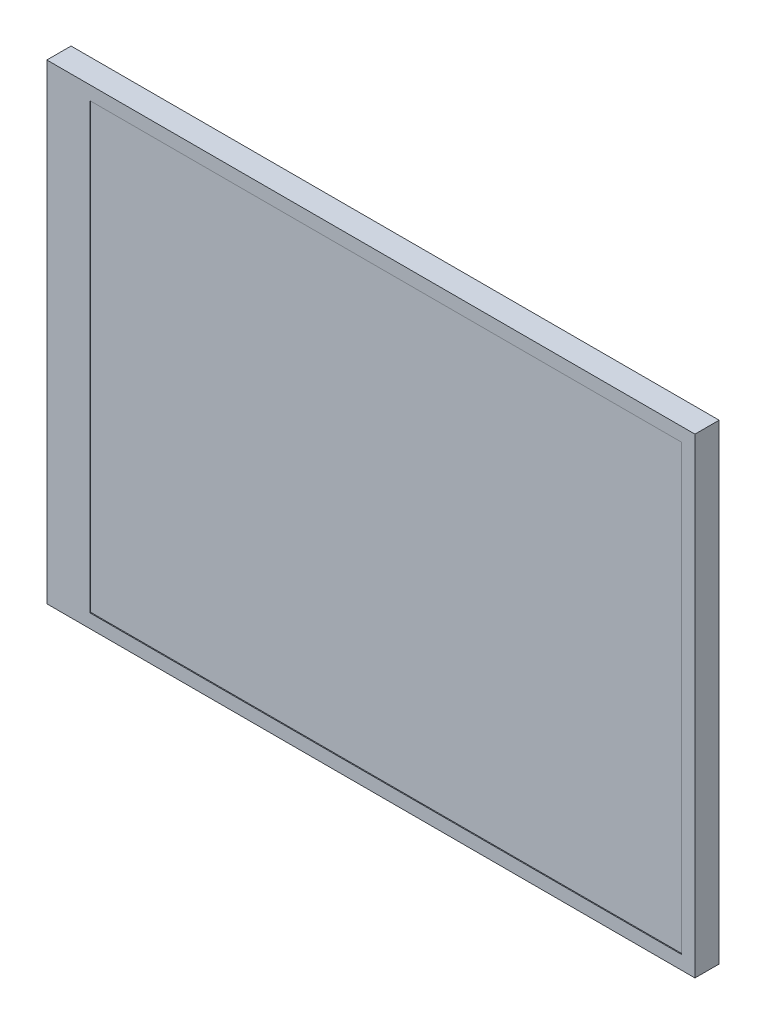
ISO-10303-21;
HEADER;
FILE_DESCRIPTION(('STEP AP214'),'2;1');
FILE_NAME('part.step','',(''),(''),'','','');
FILE_SCHEMA(('AUTOMOTIVE_DESIGN { 1 0 10303 214 1 1 1 1 }'));
ENDSEC;
DATA;
#1=APPLICATION_CONTEXT('core data for automotive mechanical design processes');
#2=APPLICATION_PROTOCOL_DEFINITION('international standard','automotive_design',2000,#1);
#3=PRODUCT_CONTEXT('',#1,'mechanical');
#4=PRODUCT('Part','Part','',(#3));
#5=PRODUCT_RELATED_PRODUCT_CATEGORY('part','',(#4));
#6=PRODUCT_DEFINITION_FORMATION('','',#4);
#7=PRODUCT_DEFINITION_CONTEXT('part definition',#1,'design');
#8=PRODUCT_DEFINITION('design','',#6,#7);
#9=PRODUCT_DEFINITION_SHAPE('','',#8);
#10=(LENGTH_UNIT() NAMED_UNIT(*) SI_UNIT(.MILLI.,.METRE.));
#11=(NAMED_UNIT(*) PLANE_ANGLE_UNIT() SI_UNIT($,.RADIAN.));
#12=(NAMED_UNIT(*) SI_UNIT($,.STERADIAN.) SOLID_ANGLE_UNIT());
#13=UNCERTAINTY_MEASURE_WITH_UNIT(LENGTH_MEASURE(1.E-05),#10,'distance_accuracy_value','');
#14=(GEOMETRIC_REPRESENTATION_CONTEXT(3) GLOBAL_UNCERTAINTY_ASSIGNED_CONTEXT((#13)) GLOBAL_UNIT_ASSIGNED_CONTEXT((#10,
#11,#12)) REPRESENTATION_CONTEXT('',''));
#15=CARTESIAN_POINT('',(0.,0.,0.));
#16=DIRECTION('',(0.,0.,1.));
#17=DIRECTION('',(1.,0.,0.));
#18=AXIS2_PLACEMENT_3D('',#15,#16,#17);
#19=CARTESIAN_POINT('',(34.,-24.3,2.55));
#20=DIRECTION('',(0.,0.,-1.));
#21=DIRECTION('',(-1.,0.,0.));
#22=AXIS2_PLACEMENT_3D('',#19,#20,#21);
#23=PLANE('',#22);
#24=DIRECTION('',(-1.,0.,0.));
#25=VECTOR('',#24,1.);
#26=CARTESIAN_POINT('',(34.,24.3,2.55));
#27=LINE('',#26,#25);
#28=CARTESIAN_POINT('',(34.,24.3,2.55));
#29=VERTEX_POINT('',#28);
#30=CARTESIAN_POINT('',(-30.8,24.3,2.55));
#31=VERTEX_POINT('',#30);
#32=EDGE_CURVE('E103',#29,#31,#27,.T.);
#33=ORIENTED_EDGE('',*,*,#32,.T.);
#34=DIRECTION('',(0.,1.,0.));
#35=VECTOR('',#34,1.);
#36=CARTESIAN_POINT('',(-30.8,24.3,2.55));
#37=LINE('',#36,#35);
#38=CARTESIAN_POINT('',(-30.8,-24.3,2.55));
#39=VERTEX_POINT('',#38);
#40=EDGE_CURVE('E95',#31,#39,#37,.F.);
#41=ORIENTED_EDGE('',*,*,#40,.T.);
#42=DIRECTION('',(1.,0.,0.));
#43=VECTOR('',#42,1.);
#44=CARTESIAN_POINT('',(34.,-24.3,2.55));
#45=LINE('',#44,#43);
#46=CARTESIAN_POINT('',(34.,-24.3,2.55));
#47=VERTEX_POINT('',#46);
#48=EDGE_CURVE('E79',#39,#47,#45,.T.);
#49=ORIENTED_EDGE('',*,*,#48,.T.);
#50=DIRECTION('',(0.,1.,0.));
#51=VECTOR('',#50,1.);
#52=CARTESIAN_POINT('',(34.,24.3,2.55));
#53=LINE('',#52,#51);
#54=EDGE_CURVE('E19',#47,#29,#53,.T.);
#55=ORIENTED_EDGE('',*,*,#54,.T.);
#56=EDGE_LOOP('',(#33,#41,#49,#55));
#57=FACE_BOUND('',#56,.T.);
#58=ADVANCED_FACE('F16',(#57),#23,.F.);
#59=CARTESIAN_POINT('',(34.,24.3,2.55));
#60=DIRECTION('',(1.,0.,0.));
#61=DIRECTION('',(0.,1.,0.));
#62=AXIS2_PLACEMENT_3D('',#59,#60,#61);
#63=PLANE('',#62);
#64=DIRECTION('',(0.,0.,1.));
#65=VECTOR('',#64,1.);
#66=CARTESIAN_POINT('',(34.,24.3,2.55));
#67=LINE('',#66,#65);
#68=CARTESIAN_POINT('',(34.,24.3,2.65));
#69=VERTEX_POINT('',#68);
#70=EDGE_CURVE('E89',#69,#29,#67,.F.);
#71=ORIENTED_EDGE('',*,*,#70,.T.);
#72=ORIENTED_EDGE('',*,*,#54,.F.);
#73=DIRECTION('',(0.,0.,1.));
#74=VECTOR('',#73,1.);
#75=CARTESIAN_POINT('',(34.,-24.3,2.55));
#76=LINE('',#75,#74);
#77=CARTESIAN_POINT('',(34.,-24.3,2.65));
#78=VERTEX_POINT('',#77);
#79=EDGE_CURVE('E87',#47,#78,#76,.T.);
#80=ORIENTED_EDGE('',*,*,#79,.T.);
#81=DIRECTION('',(0.,1.,0.));
#82=VECTOR('',#81,1.);
#83=CARTESIAN_POINT('',(34.,-25.8,2.65));
#84=LINE('',#83,#82);
#85=EDGE_CURVE('E108',#69,#78,#84,.F.);
#86=ORIENTED_EDGE('',*,*,#85,.F.);
#87=EDGE_LOOP('',(#71,#72,#80,#86));
#88=FACE_BOUND('',#87,.T.);
#89=ADVANCED_FACE('F85',(#88),#63,.F.);
#90=CARTESIAN_POINT('',(34.,-24.3,2.55));
#91=DIRECTION('',(0.,-1.,0.));
#92=DIRECTION('',(1.,0.,0.));
#93=AXIS2_PLACEMENT_3D('',#90,#91,#92);
#94=PLANE('',#93);
#95=ORIENTED_EDGE('',*,*,#79,.F.);
#96=ORIENTED_EDGE('',*,*,#48,.F.);
#97=DIRECTION('',(0.,0.,1.));
#98=VECTOR('',#97,1.);
#99=CARTESIAN_POINT('',(-30.8,-24.3,2.55));
#100=LINE('',#99,#98);
#101=CARTESIAN_POINT('',(-30.8,-24.3,2.65));
#102=VERTEX_POINT('',#101);
#103=EDGE_CURVE('E100',#39,#102,#100,.T.);
#104=ORIENTED_EDGE('',*,*,#103,.T.);
#105=DIRECTION('',(1.,0.,0.));
#106=VECTOR('',#105,1.);
#107=CARTESIAN_POINT('',(-35.5,-24.3,2.65));
#108=LINE('',#107,#106);
#109=EDGE_CURVE('E94',#78,#102,#108,.F.);
#110=ORIENTED_EDGE('',*,*,#109,.F.);
#111=EDGE_LOOP('',(#95,#96,#104,#110));
#112=FACE_BOUND('',#111,.T.);
#113=ADVANCED_FACE('F93',(#112),#94,.F.);
#114=CARTESIAN_POINT('',(-30.8,24.3,2.55));
#115=DIRECTION('',(-1.,0.,0.));
#116=DIRECTION('',(0.,0.,1.));
#117=AXIS2_PLACEMENT_3D('',#114,#115,#116);
#118=PLANE('',#117);
#119=ORIENTED_EDGE('',*,*,#103,.F.);
#120=ORIENTED_EDGE('',*,*,#40,.F.);
#121=DIRECTION('',(0.,0.,1.));
#122=VECTOR('',#121,1.);
#123=CARTESIAN_POINT('',(-30.8,24.3,2.55));
#124=LINE('',#123,#122);
#125=CARTESIAN_POINT('',(-30.8,24.3,2.65));
#126=VERTEX_POINT('',#125);
#127=EDGE_CURVE('E105',#31,#126,#124,.T.);
#128=ORIENTED_EDGE('',*,*,#127,.T.);
#129=DIRECTION('',(0.,1.,0.));
#130=VECTOR('',#129,1.);
#131=CARTESIAN_POINT('',(-30.8,-25.8,2.65));
#132=LINE('',#131,#130);
#133=EDGE_CURVE('E111',#102,#126,#132,.T.);
#134=ORIENTED_EDGE('',*,*,#133,.F.);
#135=EDGE_LOOP('',(#119,#120,#128,#134));
#136=FACE_BOUND('',#135,.T.);
#137=ADVANCED_FACE('F177',(#136),#118,.F.);
#138=CARTESIAN_POINT('',(34.,24.3,2.55));
#139=DIRECTION('',(0.,1.,0.));
#140=DIRECTION('',(-1.,0.,0.));
#141=AXIS2_PLACEMENT_3D('',#138,#139,#140);
#142=PLANE('',#141);
#143=ORIENTED_EDGE('',*,*,#127,.F.);
#144=ORIENTED_EDGE('',*,*,#32,.F.);
#145=ORIENTED_EDGE('',*,*,#70,.F.);
#146=DIRECTION('',(1.,0.,0.));
#147=VECTOR('',#146,1.);
#148=CARTESIAN_POINT('',(-35.5,24.3,2.65));
#149=LINE('',#148,#147);
#150=EDGE_CURVE('E113',#126,#69,#149,.T.);
#151=ORIENTED_EDGE('',*,*,#150,.F.);
#152=EDGE_LOOP('',(#143,#144,#145,#151));
#153=FACE_BOUND('',#152,.T.);
#154=ADVANCED_FACE('F173',(#153),#142,.F.);
#155=CARTESIAN_POINT('',(-35.5,-25.8,2.65));
#156=DIRECTION('',(0.,0.,1.));
#157=DIRECTION('',(1.,0.,0.));
#158=AXIS2_PLACEMENT_3D('',#155,#156,#157);
#159=PLANE('',#158);
#160=DIRECTION('',(0.,-1.,0.));
#161=VECTOR('',#160,1.);
#162=CARTESIAN_POINT('',(35.5,25.8,2.65));
#163=LINE('',#162,#161);
#164=CARTESIAN_POINT('',(35.5,-25.8,2.65));
#165=VERTEX_POINT('',#164);
#166=CARTESIAN_POINT('',(35.5,25.8,2.65));
#167=VERTEX_POINT('',#166);
#168=EDGE_CURVE('E121',#165,#167,#163,.F.);
#169=ORIENTED_EDGE('',*,*,#168,.T.);
#170=DIRECTION('',(1.,0.,0.));
#171=VECTOR('',#170,1.);
#172=CARTESIAN_POINT('',(-35.5,25.8,2.65));
#173=LINE('',#172,#171);
#174=CARTESIAN_POINT('',(-35.5,25.8,2.65));
#175=VERTEX_POINT('',#174);
#176=EDGE_CURVE('E126',#167,#175,#173,.F.);
#177=ORIENTED_EDGE('',*,*,#176,.T.);
#178=DIRECTION('',(0.,1.,0.));
#179=VECTOR('',#178,1.);
#180=CARTESIAN_POINT('',(-35.5,25.8,2.65));
#181=LINE('',#180,#179);
#182=CARTESIAN_POINT('',(-35.5,-25.8,2.65));
#183=VERTEX_POINT('',#182);
#184=EDGE_CURVE('E129',#175,#183,#181,.F.);
#185=ORIENTED_EDGE('',*,*,#184,.T.);
#186=DIRECTION('',(1.,0.,0.));
#187=VECTOR('',#186,1.);
#188=CARTESIAN_POINT('',(-35.5,-25.8,2.65));
#189=LINE('',#188,#187);
#190=EDGE_CURVE('E116',#183,#165,#189,.T.);
#191=ORIENTED_EDGE('',*,*,#190,.T.);
#192=EDGE_LOOP('',(#169,#177,#185,#191));
#193=FACE_BOUND('',#192,.T.);
#194=ORIENTED_EDGE('',*,*,#133,.T.);
#195=ORIENTED_EDGE('',*,*,#150,.T.);
#196=ORIENTED_EDGE('',*,*,#85,.T.);
#197=ORIENTED_EDGE('',*,*,#109,.T.);
#198=EDGE_LOOP('',(#194,#195,#196,#197));
#199=FACE_BOUND('',#198,.T.);
#200=ADVANCED_FACE('F170',(#193,#199),#159,.T.);
#201=CARTESIAN_POINT('',(-35.5,-25.8,2.65));
#202=DIRECTION('',(0.,1.,0.));
#203=DIRECTION('',(0.,0.,1.));
#204=AXIS2_PLACEMENT_3D('',#201,#202,#203);
#205=PLANE('',#204);
#206=DIRECTION('',(0.,0.,1.));
#207=VECTOR('',#206,1.);
#208=CARTESIAN_POINT('',(35.5,-25.8,2.65));
#209=LINE('',#208,#207);
#210=CARTESIAN_POINT('',(35.5,-25.8,0.));
#211=VERTEX_POINT('',#210);
#212=EDGE_CURVE('E118',#211,#165,#209,.T.);
#213=ORIENTED_EDGE('',*,*,#212,.T.);
#214=ORIENTED_EDGE('',*,*,#190,.F.);
#215=DIRECTION('',(0.,0.,1.));
#216=VECTOR('',#215,1.);
#217=CARTESIAN_POINT('',(-35.5,-25.8,2.65));
#218=LINE('',#217,#216);
#219=CARTESIAN_POINT('',(-35.5,-25.8,0.));
#220=VERTEX_POINT('',#219);
#221=EDGE_CURVE('E132',#183,#220,#218,.F.);
#222=ORIENTED_EDGE('',*,*,#221,.T.);
#223=DIRECTION('',(1.,0.,0.));
#224=VECTOR('',#223,1.);
#225=CARTESIAN_POINT('',(-35.5,-25.8,0.));
#226=LINE('',#225,#224);
#227=EDGE_CURVE('E135',#220,#211,#226,.T.);
#228=ORIENTED_EDGE('',*,*,#227,.T.);
#229=EDGE_LOOP('',(#213,#214,#222,#228));
#230=FACE_BOUND('',#229,.T.);
#231=ADVANCED_FACE('F153',(#230),#205,.F.);
#232=CARTESIAN_POINT('',(35.5,25.8,2.65));
#233=DIRECTION('',(-1.,0.,0.));
#234=DIRECTION('',(0.,-1.,0.));
#235=AXIS2_PLACEMENT_3D('',#232,#233,#234);
#236=PLANE('',#235);
#237=DIRECTION('',(0.,0.,-1.));
#238=VECTOR('',#237,1.);
#239=CARTESIAN_POINT('',(35.5,25.8,2.65));
#240=LINE('',#239,#238);
#241=CARTESIAN_POINT('',(35.5,25.8,0.));
#242=VERTEX_POINT('',#241);
#243=EDGE_CURVE('E123',#242,#167,#240,.F.);
#244=ORIENTED_EDGE('',*,*,#243,.T.);
#245=ORIENTED_EDGE('',*,*,#168,.F.);
#246=ORIENTED_EDGE('',*,*,#212,.F.);
#247=DIRECTION('',(0.,1.,0.));
#248=VECTOR('',#247,1.);
#249=CARTESIAN_POINT('',(35.5,-25.8,0.));
#250=LINE('',#249,#248);
#251=EDGE_CURVE('E138',#211,#242,#250,.T.);
#252=ORIENTED_EDGE('',*,*,#251,.T.);
#253=EDGE_LOOP('',(#244,#245,#246,#252));
#254=FACE_BOUND('',#253,.T.);
#255=ADVANCED_FACE('F150',(#254),#236,.F.);
#256=CARTESIAN_POINT('',(-35.5,25.8,2.65));
#257=DIRECTION('',(0.,-1.,0.));
#258=DIRECTION('',(0.,0.,-1.));
#259=AXIS2_PLACEMENT_3D('',#256,#257,#258);
#260=PLANE('',#259);
#261=DIRECTION('',(0.,0.,1.));
#262=VECTOR('',#261,1.);
#263=CARTESIAN_POINT('',(-35.5,25.8,2.65));
#264=LINE('',#263,#262);
#265=CARTESIAN_POINT('',(-35.5,25.8,0.));
#266=VERTEX_POINT('',#265);
#267=EDGE_CURVE('E33',#266,#175,#264,.T.);
#268=ORIENTED_EDGE('',*,*,#267,.T.);
#269=ORIENTED_EDGE('',*,*,#176,.F.);
#270=ORIENTED_EDGE('',*,*,#243,.F.);
#271=DIRECTION('',(1.,0.,0.));
#272=VECTOR('',#271,1.);
#273=CARTESIAN_POINT('',(-35.5,25.8,0.));
#274=LINE('',#273,#272);
#275=EDGE_CURVE('E25',#242,#266,#274,.F.);
#276=ORIENTED_EDGE('',*,*,#275,.T.);
#277=EDGE_LOOP('',(#268,#269,#270,#276));
#278=FACE_BOUND('',#277,.T.);
#279=ADVANCED_FACE('F144',(#278),#260,.F.);
#280=CARTESIAN_POINT('',(-35.5,25.8,2.65));
#281=DIRECTION('',(1.,0.,0.));
#282=DIRECTION('',(0.,1.,0.));
#283=AXIS2_PLACEMENT_3D('',#280,#281,#282);
#284=PLANE('',#283);
#285=ORIENTED_EDGE('',*,*,#221,.F.);
#286=ORIENTED_EDGE('',*,*,#184,.F.);
#287=ORIENTED_EDGE('',*,*,#267,.F.);
#288=DIRECTION('',(0.,1.,0.));
#289=VECTOR('',#288,1.);
#290=CARTESIAN_POINT('',(-35.5,-25.8,0.));
#291=LINE('',#290,#289);
#292=EDGE_CURVE('E11',#266,#220,#291,.F.);
#293=ORIENTED_EDGE('',*,*,#292,.T.);
#294=EDGE_LOOP('',(#285,#286,#287,#293));
#295=FACE_BOUND('',#294,.T.);
#296=ADVANCED_FACE('F155',(#295),#284,.F.);
#297=CARTESIAN_POINT('',(-35.5,-25.8,0.));
#298=DIRECTION('',(0.,0.,1.));
#299=DIRECTION('',(1.,0.,0.));
#300=AXIS2_PLACEMENT_3D('',#297,#298,#299);
#301=PLANE('',#300);
#302=ORIENTED_EDGE('',*,*,#275,.F.);
#303=ORIENTED_EDGE('',*,*,#251,.F.);
#304=ORIENTED_EDGE('',*,*,#227,.F.);
#305=ORIENTED_EDGE('',*,*,#292,.F.);
#306=EDGE_LOOP('',(#302,#303,#304,#305));
#307=FACE_BOUND('',#306,.T.);
#308=ADVANCED_FACE('F148',(#307),#301,.F.);
#309=CLOSED_SHELL('',(#58,#89,#113,#137,#154,#200,#231,#255,#279,#296,#308));
#310=MANIFOLD_SOLID_BREP('B1',#309);
#311=ADVANCED_BREP_SHAPE_REPRESENTATION('',(#18,#310),#14);
#312=SHAPE_DEFINITION_REPRESENTATION(#9,#311);
ENDSEC;
END-ISO-10303-21;
